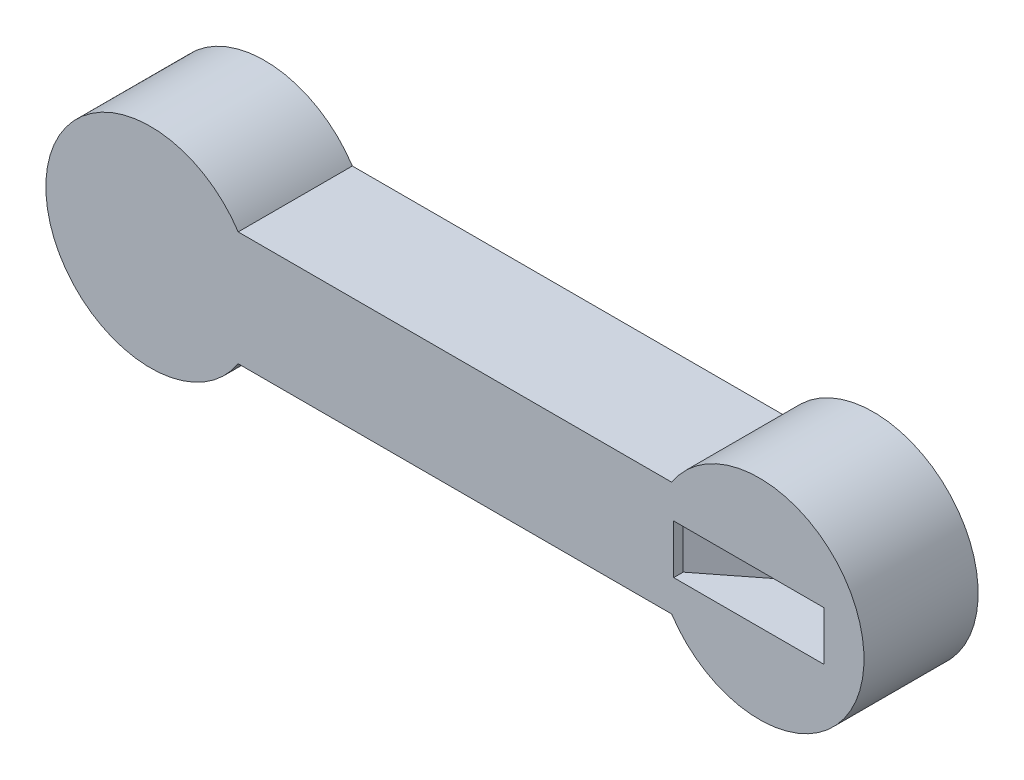
ISO-10303-21;
HEADER;
FILE_DESCRIPTION(('STEP AP214'),'2;1');
FILE_NAME('part.step','',(''),(''),'','','');
FILE_SCHEMA(('AUTOMOTIVE_DESIGN { 1 0 10303 214 1 1 1 1 }'));
ENDSEC;
DATA;
#1=APPLICATION_CONTEXT('core data for automotive mechanical design processes');
#2=APPLICATION_PROTOCOL_DEFINITION('international standard','automotive_design',2000,#1);
#3=PRODUCT_CONTEXT('',#1,'mechanical');
#4=PRODUCT('Part','Part','',(#3));
#5=PRODUCT_RELATED_PRODUCT_CATEGORY('part','',(#4));
#6=PRODUCT_DEFINITION_FORMATION('','',#4);
#7=PRODUCT_DEFINITION_CONTEXT('part definition',#1,'design');
#8=PRODUCT_DEFINITION('design','',#6,#7);
#9=PRODUCT_DEFINITION_SHAPE('','',#8);
#10=(LENGTH_UNIT() NAMED_UNIT(*) SI_UNIT(.MILLI.,.METRE.));
#11=(NAMED_UNIT(*) PLANE_ANGLE_UNIT() SI_UNIT($,.RADIAN.));
#12=(NAMED_UNIT(*) SI_UNIT($,.STERADIAN.) SOLID_ANGLE_UNIT());
#13=UNCERTAINTY_MEASURE_WITH_UNIT(LENGTH_MEASURE(1.E-05),#10,'distance_accuracy_value','');
#14=(GEOMETRIC_REPRESENTATION_CONTEXT(3) GLOBAL_UNCERTAINTY_ASSIGNED_CONTEXT((#13)) GLOBAL_UNIT_ASSIGNED_CONTEXT((#10,
#11,#12)) REPRESENTATION_CONTEXT('',''));
#15=CARTESIAN_POINT('',(0.,0.,0.));
#16=DIRECTION('',(0.,0.,1.));
#17=DIRECTION('',(1.,0.,0.));
#18=AXIS2_PLACEMENT_3D('',#15,#16,#17);
#19=CARTESIAN_POINT('',(0.,0.,30.));
#20=DIRECTION('',(0.,0.,1.));
#21=DIRECTION('',(1.,0.,0.));
#22=AXIS2_PLACEMENT_3D('',#19,#20,#21);
#23=PLANE('',#22);
#24=CARTESIAN_POINT('',(0.,0.,30.));
#25=DIRECTION('',(0.,0.,1.));
#26=DIRECTION('',(1.,0.,0.));
#27=AXIS2_PLACEMENT_3D('',#24,#25,#26);
#28=CIRCLE('',#27,27.5);
#29=CARTESIAN_POINT('',(23.0488611432322,15.,30.));
#30=VERTEX_POINT('',#29);
#31=CARTESIAN_POINT('',(23.0488611432322,-15.,30.));
#32=VERTEX_POINT('',#31);
#33=EDGE_CURVE('E216',#30,#32,#28,.T.);
#34=ORIENTED_EDGE('',*,*,#33,.T.);
#35=DIRECTION('',(1.,0.,0.));
#36=VECTOR('',#35,1.);
#37=CARTESIAN_POINT('',(0.,-15.,30.));
#38=LINE('',#37,#36);
#39=CARTESIAN_POINT('',(136.951138856768,-15.,30.));
#40=VERTEX_POINT('',#39);
#41=EDGE_CURVE('E219',#32,#40,#38,.T.);
#42=ORIENTED_EDGE('',*,*,#41,.T.);
#43=CARTESIAN_POINT('',(160.,0.,30.));
#44=DIRECTION('',(0.,0.,1.));
#45=DIRECTION('',(1.,0.,0.));
#46=AXIS2_PLACEMENT_3D('',#43,#44,#45);
#47=CIRCLE('',#46,27.5);
#48=CARTESIAN_POINT('',(136.951138856768,15.,30.));
#49=VERTEX_POINT('',#48);
#50=EDGE_CURVE('E222',#40,#49,#47,.T.);
#51=ORIENTED_EDGE('',*,*,#50,.T.);
#52=DIRECTION('',(1.,0.,0.));
#53=VECTOR('',#52,1.);
#54=CARTESIAN_POINT('',(0.,15.,30.));
#55=LINE('',#54,#53);
#56=EDGE_CURVE('E224',#30,#49,#55,.T.);
#57=ORIENTED_EDGE('',*,*,#56,.F.);
#58=EDGE_LOOP('',(#34,#42,#51,#57));
#59=FACE_BOUND('',#58,.T.);
#60=DIRECTION('',(0.,-1.,0.));
#61=VECTOR('',#60,1.);
#62=CARTESIAN_POINT('',(137.49791436977,6.45,30.));
#63=LINE('',#62,#61);
#64=CARTESIAN_POINT('',(137.49791436977,6.45,30.));
#65=VERTEX_POINT('',#64);
#66=CARTESIAN_POINT('',(137.49791436977,-6.45,30.));
#67=VERTEX_POINT('',#66);
#68=EDGE_CURVE('E160',#65,#67,#63,.T.);
#69=ORIENTED_EDGE('',*,*,#68,.F.);
#70=DIRECTION('',(-1.,0.,0.));
#71=VECTOR('',#70,1.);
#72=CARTESIAN_POINT('',(0.,6.45000000000005,30.));
#73=LINE('',#72,#71);
#74=CARTESIAN_POINT('',(176.95,6.45000000000005,30.));
#75=VERTEX_POINT('',#74);
#76=EDGE_CURVE('E145',#75,#65,#73,.T.);
#77=ORIENTED_EDGE('',*,*,#76,.F.);
#78=DIRECTION('',(0.,-1.,0.));
#79=VECTOR('',#78,1.);
#80=CARTESIAN_POINT('',(176.95,0.,30.));
#81=LINE('',#80,#79);
#82=CARTESIAN_POINT('',(176.95,-6.44999999999995,30.));
#83=VERTEX_POINT('',#82);
#84=EDGE_CURVE('E57',#75,#83,#81,.T.);
#85=ORIENTED_EDGE('',*,*,#84,.T.);
#86=DIRECTION('',(1.,0.,0.));
#87=VECTOR('',#86,1.);
#88=CARTESIAN_POINT('',(0.,-6.44999999999995,30.));
#89=LINE('',#88,#87);
#90=EDGE_CURVE('E166',#67,#83,#89,.T.);
#91=ORIENTED_EDGE('',*,*,#90,.F.);
#92=EDGE_LOOP('',(#69,#77,#85,#91));
#93=FACE_BOUND('',#92,.T.);
#94=ADVANCED_FACE('F41',(#59,#93),#23,.T.);
#95=CARTESIAN_POINT('',(0.,0.,4.5));
#96=DIRECTION('',(0.,0.,-1.));
#97=DIRECTION('',(-1.,0.,0.));
#98=AXIS2_PLACEMENT_3D('',#95,#96,#97);
#99=PLANE('',#98);
#100=DIRECTION('',(1.,0.,0.));
#101=VECTOR('',#100,1.);
#102=CARTESIAN_POINT('',(148.519342789878,6.45000000000005,4.5));
#103=LINE('',#102,#101);
#104=CARTESIAN_POINT('',(148.519342789878,6.45000000000005,4.5));
#105=VERTEX_POINT('',#104);
#106=CARTESIAN_POINT('',(153.497914369771,6.45000000000005,4.5));
#107=VERTEX_POINT('',#106);
#108=EDGE_CURVE('E187',#105,#107,#103,.T.);
#109=ORIENTED_EDGE('',*,*,#108,.T.);
#110=DIRECTION('',(0.,-1.,0.));
#111=VECTOR('',#110,1.);
#112=CARTESIAN_POINT('',(153.497914369771,0.,4.5));
#113=LINE('',#112,#111);
#114=CARTESIAN_POINT('',(153.497914369771,-6.44999999999995,4.5));
#115=VERTEX_POINT('',#114);
#116=EDGE_CURVE('E11',#107,#115,#113,.T.);
#117=ORIENTED_EDGE('',*,*,#116,.T.);
#118=DIRECTION('',(-1.,0.,0.));
#119=VECTOR('',#118,1.);
#120=CARTESIAN_POINT('',(148.519342789878,-6.44999999999995,4.5));
#121=LINE('',#120,#119);
#122=CARTESIAN_POINT('',(148.519342789878,-6.44999999999995,4.5));
#123=VERTEX_POINT('',#122);
#124=EDGE_CURVE('E193',#115,#123,#121,.T.);
#125=ORIENTED_EDGE('',*,*,#124,.T.);
#126=DIRECTION('',(0.,1.,0.));
#127=VECTOR('',#126,1.);
#128=CARTESIAN_POINT('',(148.519342789878,-6.44999999999995,4.5));
#129=LINE('',#128,#127);
#130=EDGE_CURVE('E182',#123,#105,#129,.T.);
#131=ORIENTED_EDGE('',*,*,#130,.T.);
#132=EDGE_LOOP('',(#109,#117,#125,#131));
#133=FACE_BOUND('',#132,.T.);
#134=ADVANCED_FACE('F270',(#133),#99,.T.);
#135=CARTESIAN_POINT('',(0.,0.,30.));
#136=DIRECTION('',(0.,0.,-1.));
#137=DIRECTION('',(-1.,0.,0.));
#138=AXIS2_PLACEMENT_3D('',#135,#136,#137);
#139=CYLINDRICAL_SURFACE('',#138,27.5);
#140=CARTESIAN_POINT('',(0.,0.,0.));
#141=DIRECTION('',(0.,0.,1.));
#142=DIRECTION('',(1.,0.,0.));
#143=AXIS2_PLACEMENT_3D('',#140,#141,#142);
#144=CIRCLE('',#143,27.5);
#145=CARTESIAN_POINT('',(23.0488611432322,15.,0.));
#146=VERTEX_POINT('',#145);
#147=CARTESIAN_POINT('',(23.0488611432322,-15.,0.));
#148=VERTEX_POINT('',#147);
#149=EDGE_CURVE('E208',#146,#148,#144,.T.);
#150=ORIENTED_EDGE('',*,*,#149,.T.);
#151=DIRECTION('',(0.,0.,-1.));
#152=VECTOR('',#151,1.);
#153=CARTESIAN_POINT('',(23.0488611432322,-15.,30.));
#154=LINE('',#153,#152);
#155=EDGE_CURVE('E243',#32,#148,#154,.T.);
#156=ORIENTED_EDGE('',*,*,#155,.F.);
#157=ORIENTED_EDGE('',*,*,#33,.F.);
#158=DIRECTION('',(0.,0.,-1.));
#159=VECTOR('',#158,1.);
#160=CARTESIAN_POINT('',(23.0488611432322,15.,30.));
#161=LINE('',#160,#159);
#162=EDGE_CURVE('E227',#30,#146,#161,.T.);
#163=ORIENTED_EDGE('',*,*,#162,.T.);
#164=EDGE_LOOP('',(#150,#156,#157,#163));
#165=FACE_BOUND('',#164,.T.);
#166=ADVANCED_FACE('F43',(#165),#139,.T.);
#167=CARTESIAN_POINT('',(0.,-15.,30.));
#168=DIRECTION('',(0.,1.,0.));
#169=DIRECTION('',(-1.,0.,0.));
#170=AXIS2_PLACEMENT_3D('',#167,#168,#169);
#171=PLANE('',#170);
#172=DIRECTION('',(1.,0.,0.));
#173=VECTOR('',#172,1.);
#174=CARTESIAN_POINT('',(0.,-15.,0.));
#175=LINE('',#174,#173);
#176=CARTESIAN_POINT('',(136.951138856768,-15.,0.));
#177=VERTEX_POINT('',#176);
#178=EDGE_CURVE('E230',#148,#177,#175,.T.);
#179=ORIENTED_EDGE('',*,*,#178,.T.);
#180=DIRECTION('',(0.,0.,-1.));
#181=VECTOR('',#180,1.);
#182=CARTESIAN_POINT('',(136.951138856768,-15.,30.));
#183=LINE('',#182,#181);
#184=EDGE_CURVE('E240',#40,#177,#183,.T.);
#185=ORIENTED_EDGE('',*,*,#184,.F.);
#186=ORIENTED_EDGE('',*,*,#41,.F.);
#187=ORIENTED_EDGE('',*,*,#155,.T.);
#188=EDGE_LOOP('',(#179,#185,#186,#187));
#189=FACE_BOUND('',#188,.T.);
#190=ADVANCED_FACE('F322',(#189),#171,.F.);
#191=CARTESIAN_POINT('',(160.,0.,30.));
#192=DIRECTION('',(0.,0.,-1.));
#193=DIRECTION('',(-1.,0.,0.));
#194=AXIS2_PLACEMENT_3D('',#191,#192,#193);
#195=CYLINDRICAL_SURFACE('',#194,27.5);
#196=CARTESIAN_POINT('',(160.,0.,0.));
#197=DIRECTION('',(0.,0.,1.));
#198=DIRECTION('',(1.,0.,0.));
#199=AXIS2_PLACEMENT_3D('',#196,#197,#198);
#200=CIRCLE('',#199,27.5);
#201=CARTESIAN_POINT('',(136.951138856768,15.,0.));
#202=VERTEX_POINT('',#201);
#203=EDGE_CURVE('E232',#177,#202,#200,.T.);
#204=ORIENTED_EDGE('',*,*,#203,.T.);
#205=DIRECTION('',(0.,0.,-1.));
#206=VECTOR('',#205,1.);
#207=CARTESIAN_POINT('',(136.951138856768,15.,30.));
#208=LINE('',#207,#206);
#209=EDGE_CURVE('E238',#49,#202,#208,.T.);
#210=ORIENTED_EDGE('',*,*,#209,.F.);
#211=ORIENTED_EDGE('',*,*,#50,.F.);
#212=ORIENTED_EDGE('',*,*,#184,.T.);
#213=EDGE_LOOP('',(#204,#210,#211,#212));
#214=FACE_BOUND('',#213,.T.);
#215=ADVANCED_FACE('F319',(#214),#195,.T.);
#216=CARTESIAN_POINT('',(0.,15.,30.));
#217=DIRECTION('',(0.,1.,0.));
#218=DIRECTION('',(0.,0.,1.));
#219=AXIS2_PLACEMENT_3D('',#216,#217,#218);
#220=PLANE('',#219);
#221=DIRECTION('',(1.,0.,0.));
#222=VECTOR('',#221,1.);
#223=CARTESIAN_POINT('',(0.,15.,0.));
#224=LINE('',#223,#222);
#225=EDGE_CURVE('E220',#146,#202,#224,.T.);
#226=ORIENTED_EDGE('',*,*,#225,.F.);
#227=ORIENTED_EDGE('',*,*,#162,.F.);
#228=ORIENTED_EDGE('',*,*,#56,.T.);
#229=ORIENTED_EDGE('',*,*,#209,.T.);
#230=EDGE_LOOP('',(#226,#227,#228,#229));
#231=FACE_BOUND('',#230,.T.);
#232=ADVANCED_FACE('F316',(#231),#220,.T.);
#233=CARTESIAN_POINT('',(0.,0.,0.));
#234=DIRECTION('',(0.,0.,1.));
#235=DIRECTION('',(1.,0.,0.));
#236=AXIS2_PLACEMENT_3D('',#233,#234,#235);
#237=PLANE('',#236);
#238=CARTESIAN_POINT('',(0.,0.,0.));
#239=DIRECTION('',(0.,0.,1.));
#240=DIRECTION('',(1.,0.,0.));
#241=AXIS2_PLACEMENT_3D('',#238,#239,#240);
#242=CIRCLE('',#241,20.0000000000004);
#243=CARTESIAN_POINT('',(20.0000000000004,0.,0.));
#244=VERTEX_POINT('',#243);
#245=EDGE_CURVE('E45',#244,#244,#242,.T.);
#246=ORIENTED_EDGE('',*,*,#245,.T.);
#247=EDGE_LOOP('',(#246));
#248=FACE_BOUND('',#247,.T.);
#249=DIRECTION('',(1.,0.,0.));
#250=VECTOR('',#249,1.);
#251=CARTESIAN_POINT('',(148.519342789878,6.45000000000005,0.));
#252=LINE('',#251,#250);
#253=CARTESIAN_POINT('',(148.519342789878,6.45000000000005,0.));
#254=VERTEX_POINT('',#253);
#255=CARTESIAN_POINT('',(181.919342789878,6.45000000000005,0.));
#256=VERTEX_POINT('',#255);
#257=EDGE_CURVE('E199',#254,#256,#252,.T.);
#258=ORIENTED_EDGE('',*,*,#257,.F.);
#259=DIRECTION('',(0.,1.,0.));
#260=VECTOR('',#259,1.);
#261=CARTESIAN_POINT('',(148.519342789878,-6.44999999999995,0.));
#262=LINE('',#261,#260);
#263=CARTESIAN_POINT('',(148.519342789878,-6.44999999999995,0.));
#264=VERTEX_POINT('',#263);
#265=EDGE_CURVE('E176',#264,#254,#262,.T.);
#266=ORIENTED_EDGE('',*,*,#265,.F.);
#267=DIRECTION('',(-1.,0.,0.));
#268=VECTOR('',#267,1.);
#269=CARTESIAN_POINT('',(148.519342789878,-6.44999999999995,0.));
#270=LINE('',#269,#268);
#271=CARTESIAN_POINT('',(181.919342789878,-6.44999999999995,0.));
#272=VERTEX_POINT('',#271);
#273=EDGE_CURVE('E186',#272,#264,#270,.T.);
#274=ORIENTED_EDGE('',*,*,#273,.F.);
#275=DIRECTION('',(0.,-1.,0.));
#276=VECTOR('',#275,1.);
#277=CARTESIAN_POINT('',(181.919342789878,-6.44999999999995,0.));
#278=LINE('',#277,#276);
#279=EDGE_CURVE('E201',#256,#272,#278,.T.);
#280=ORIENTED_EDGE('',*,*,#279,.F.);
#281=EDGE_LOOP('',(#258,#266,#274,#280));
#282=FACE_BOUND('',#281,.T.);
#283=ORIENTED_EDGE('',*,*,#149,.F.);
#284=ORIENTED_EDGE('',*,*,#225,.T.);
#285=ORIENTED_EDGE('',*,*,#203,.F.);
#286=ORIENTED_EDGE('',*,*,#178,.F.);
#287=EDGE_LOOP('',(#283,#284,#285,#286));
#288=FACE_BOUND('',#287,.T.);
#289=ADVANCED_FACE('F267',(#248,#282,#288),#237,.F.);
#290=CARTESIAN_POINT('',(148.519342789878,-6.44999999999995,4.5));
#291=DIRECTION('',(-1.,0.,0.));
#292=DIRECTION('',(0.,0.,1.));
#293=AXIS2_PLACEMENT_3D('',#290,#291,#292);
#294=PLANE('',#293);
#295=ORIENTED_EDGE('',*,*,#265,.T.);
#296=DIRECTION('',(0.,0.,-1.));
#297=VECTOR('',#296,1.);
#298=CARTESIAN_POINT('',(148.519342789878,6.45000000000005,4.5));
#299=LINE('',#298,#297);
#300=EDGE_CURVE('E197',#105,#254,#299,.T.);
#301=ORIENTED_EDGE('',*,*,#300,.F.);
#302=ORIENTED_EDGE('',*,*,#130,.F.);
#303=DIRECTION('',(0.,0.,-1.));
#304=VECTOR('',#303,1.);
#305=CARTESIAN_POINT('',(148.519342789878,-6.44999999999995,4.5));
#306=LINE('',#305,#304);
#307=EDGE_CURVE('E205',#123,#264,#306,.T.);
#308=ORIENTED_EDGE('',*,*,#307,.T.);
#309=EDGE_LOOP('',(#295,#301,#302,#308));
#310=FACE_BOUND('',#309,.T.);
#311=ADVANCED_FACE('F265',(#310),#294,.F.);
#312=CARTESIAN_POINT('',(148.519342789878,-6.44999999999995,4.5));
#313=DIRECTION('',(0.,-1.,0.));
#314=DIRECTION('',(0.,0.,-1.));
#315=AXIS2_PLACEMENT_3D('',#312,#313,#314);
#316=PLANE('',#315);
#317=ORIENTED_EDGE('',*,*,#273,.T.);
#318=ORIENTED_EDGE('',*,*,#307,.F.);
#319=ORIENTED_EDGE('',*,*,#124,.F.);
#320=DIRECTION('',(0.,0.,-1.));
#321=VECTOR('',#320,1.);
#322=CARTESIAN_POINT('',(153.497914369771,-6.44999999999995,30.));
#323=LINE('',#322,#321);
#324=CARTESIAN_POINT('',(153.49791436977,-6.45,15.));
#325=VERTEX_POINT('',#324);
#326=EDGE_CURVE('E174',#325,#115,#323,.T.);
#327=ORIENTED_EDGE('',*,*,#326,.F.);
#328=DIRECTION('',(0.788024373724564,0.,-0.615644041972314));
#329=VECTOR('',#328,1.);
#330=CARTESIAN_POINT('',(65.4555466835088,-6.45,83.7830997548915));
#331=LINE('',#330,#329);
#332=CARTESIAN_POINT('',(137.49791436977,-6.45,27.5));
#333=VERTEX_POINT('',#332);
#334=EDGE_CURVE('E164',#333,#325,#331,.T.);
#335=ORIENTED_EDGE('',*,*,#334,.F.);
#336=DIRECTION('',(0.,0.,-1.));
#337=VECTOR('',#336,1.);
#338=CARTESIAN_POINT('',(137.49791436977,-6.45,-1.52653350371257E-12));
#339=LINE('',#338,#337);
#340=EDGE_CURVE('E279',#67,#333,#339,.T.);
#341=ORIENTED_EDGE('',*,*,#340,.F.);
#342=ORIENTED_EDGE('',*,*,#90,.T.);
#343=DIRECTION('',(0.,0.,-1.));
#344=VECTOR('',#343,1.);
#345=CARTESIAN_POINT('',(176.95,-6.44999999999995,30.));
#346=LINE('',#345,#344);
#347=CARTESIAN_POINT('',(176.95,-6.44999999999995,4.5));
#348=VERTEX_POINT('',#347);
#349=EDGE_CURVE('E177',#83,#348,#346,.T.);
#350=ORIENTED_EDGE('',*,*,#349,.T.);
#351=CARTESIAN_POINT('',(181.919342789878,-6.44999999999995,4.5));
#352=VERTEX_POINT('',#351);
#353=EDGE_CURVE('E194',#352,#348,#121,.T.);
#354=ORIENTED_EDGE('',*,*,#353,.F.);
#355=DIRECTION('',(0.,0.,-1.));
#356=VECTOR('',#355,1.);
#357=CARTESIAN_POINT('',(181.919342789878,-6.44999999999995,4.5));
#358=LINE('',#357,#356);
#359=EDGE_CURVE('E209',#352,#272,#358,.T.);
#360=ORIENTED_EDGE('',*,*,#359,.T.);
#361=EDGE_LOOP('',(#317,#318,#319,#327,#335,#341,#342,#350,#354,#360));
#362=FACE_BOUND('',#361,.T.);
#363=ADVANCED_FACE('F251',(#362),#316,.F.);
#364=CARTESIAN_POINT('',(181.919342789878,-6.44999999999995,4.5));
#365=DIRECTION('',(1.,0.,0.));
#366=DIRECTION('',(0.,0.,-1.));
#367=AXIS2_PLACEMENT_3D('',#364,#365,#366);
#368=PLANE('',#367);
#369=ORIENTED_EDGE('',*,*,#279,.T.);
#370=ORIENTED_EDGE('',*,*,#359,.F.);
#371=DIRECTION('',(0.,-1.,0.));
#372=VECTOR('',#371,1.);
#373=CARTESIAN_POINT('',(181.919342789878,-6.44999999999995,4.5));
#374=LINE('',#373,#372);
#375=CARTESIAN_POINT('',(181.919342789878,6.45000000000005,4.5));
#376=VERTEX_POINT('',#375);
#377=EDGE_CURVE('E190',#376,#352,#374,.T.);
#378=ORIENTED_EDGE('',*,*,#377,.F.);
#379=DIRECTION('',(0.,0.,-1.));
#380=VECTOR('',#379,1.);
#381=CARTESIAN_POINT('',(181.919342789878,6.45000000000005,4.5));
#382=LINE('',#381,#380);
#383=EDGE_CURVE('E211',#376,#256,#382,.T.);
#384=ORIENTED_EDGE('',*,*,#383,.T.);
#385=EDGE_LOOP('',(#369,#370,#378,#384));
#386=FACE_BOUND('',#385,.T.);
#387=ADVANCED_FACE('F256',(#386),#368,.F.);
#388=CARTESIAN_POINT('',(148.519342789878,6.45000000000005,4.5));
#389=DIRECTION('',(0.,1.,0.));
#390=DIRECTION('',(0.,0.,1.));
#391=AXIS2_PLACEMENT_3D('',#388,#389,#390);
#392=PLANE('',#391);
#393=CARTESIAN_POINT('',(176.95,6.45000000000005,4.5));
#394=VERTEX_POINT('',#393);
#395=EDGE_CURVE('E185',#394,#376,#103,.T.);
#396=ORIENTED_EDGE('',*,*,#395,.F.);
#397=DIRECTION('',(0.,0.,-1.));
#398=VECTOR('',#397,1.);
#399=CARTESIAN_POINT('',(176.95,6.45000000000005,30.));
#400=LINE('',#399,#398);
#401=EDGE_CURVE('E151',#75,#394,#400,.T.);
#402=ORIENTED_EDGE('',*,*,#401,.F.);
#403=ORIENTED_EDGE('',*,*,#76,.T.);
#404=DIRECTION('',(0.,0.,-1.));
#405=VECTOR('',#404,1.);
#406=CARTESIAN_POINT('',(137.49791436977,6.45,-1.52653350371257E-12));
#407=LINE('',#406,#405);
#408=CARTESIAN_POINT('',(137.49791436977,6.45,27.5));
#409=VERTEX_POINT('',#408);
#410=EDGE_CURVE('E149',#65,#409,#407,.T.);
#411=ORIENTED_EDGE('',*,*,#410,.T.);
#412=DIRECTION('',(0.788024373724564,0.,-0.615644041972314));
#413=VECTOR('',#412,1.);
#414=CARTESIAN_POINT('',(65.4555466835088,6.45,83.7830997548915));
#415=LINE('',#414,#413);
#416=CARTESIAN_POINT('',(153.49791436977,6.45,15.));
#417=VERTEX_POINT('',#416);
#418=EDGE_CURVE('E163',#409,#417,#415,.T.);
#419=ORIENTED_EDGE('',*,*,#418,.T.);
#420=DIRECTION('',(0.,0.,-1.));
#421=VECTOR('',#420,1.);
#422=CARTESIAN_POINT('',(153.497914369771,6.45000000000005,30.));
#423=LINE('',#422,#421);
#424=EDGE_CURVE('E65',#417,#107,#423,.T.);
#425=ORIENTED_EDGE('',*,*,#424,.T.);
#426=ORIENTED_EDGE('',*,*,#108,.F.);
#427=ORIENTED_EDGE('',*,*,#300,.T.);
#428=ORIENTED_EDGE('',*,*,#257,.T.);
#429=ORIENTED_EDGE('',*,*,#383,.F.);
#430=EDGE_LOOP('',(#396,#402,#403,#411,#419,#425,#426,#427,#428,#429));
#431=FACE_BOUND('',#430,.T.);
#432=ADVANCED_FACE('F148',(#431),#392,.F.);
#433=DIRECTION('',(0.,-1.,0.));
#434=VECTOR('',#433,1.);
#435=CARTESIAN_POINT('',(176.95,0.,4.5));
#436=LINE('',#435,#434);
#437=EDGE_CURVE('E50',#394,#348,#436,.T.);
#438=ORIENTED_EDGE('',*,*,#437,.F.);
#439=ORIENTED_EDGE('',*,*,#395,.T.);
#440=ORIENTED_EDGE('',*,*,#377,.T.);
#441=ORIENTED_EDGE('',*,*,#353,.T.);
#442=EDGE_LOOP('',(#438,#439,#440,#441));
#443=FACE_BOUND('',#442,.T.);
#444=ADVANCED_FACE('F252',(#443),#99,.T.);
#445=CARTESIAN_POINT('',(153.497914369771,0.,30.));
#446=DIRECTION('',(1.,0.,0.));
#447=DIRECTION('',(0.,0.,-1.));
#448=AXIS2_PLACEMENT_3D('',#445,#446,#447);
#449=PLANE('',#448);
#450=DIRECTION('',(0.,-1.,0.));
#451=VECTOR('',#450,1.);
#452=CARTESIAN_POINT('',(153.49791436977,6.45,15.));
#453=LINE('',#452,#451);
#454=EDGE_CURVE('E154',#417,#325,#453,.T.);
#455=ORIENTED_EDGE('',*,*,#454,.T.);
#456=ORIENTED_EDGE('',*,*,#326,.T.);
#457=ORIENTED_EDGE('',*,*,#116,.F.);
#458=ORIENTED_EDGE('',*,*,#424,.F.);
#459=EDGE_LOOP('',(#455,#456,#457,#458));
#460=FACE_BOUND('',#459,.T.);
#461=ADVANCED_FACE('F275',(#460),#449,.T.);
#462=CARTESIAN_POINT('',(176.95,0.,30.));
#463=DIRECTION('',(1.,0.,0.));
#464=DIRECTION('',(0.,0.,-1.));
#465=AXIS2_PLACEMENT_3D('',#462,#463,#464);
#466=PLANE('',#465);
#467=ORIENTED_EDGE('',*,*,#437,.T.);
#468=ORIENTED_EDGE('',*,*,#349,.F.);
#469=ORIENTED_EDGE('',*,*,#84,.F.);
#470=ORIENTED_EDGE('',*,*,#401,.T.);
#471=EDGE_LOOP('',(#467,#468,#469,#470));
#472=FACE_BOUND('',#471,.T.);
#473=ADVANCED_FACE('F247',(#472),#466,.F.);
#474=CARTESIAN_POINT('',(65.4555466835088,6.45,83.7830997548915));
#475=DIRECTION('',(-0.615644041972314,0.,-0.788024373724564));
#476=DIRECTION('',(-0.788024373724564,0.,0.615644041972314));
#477=AXIS2_PLACEMENT_3D('',#474,#475,#476);
#478=PLANE('',#477);
#479=ORIENTED_EDGE('',*,*,#334,.T.);
#480=ORIENTED_EDGE('',*,*,#454,.F.);
#481=ORIENTED_EDGE('',*,*,#418,.F.);
#482=DIRECTION('',(0.,-1.,0.));
#483=VECTOR('',#482,1.);
#484=CARTESIAN_POINT('',(137.49791436977,6.45,27.5));
#485=LINE('',#484,#483);
#486=EDGE_CURVE('E162',#409,#333,#485,.T.);
#487=ORIENTED_EDGE('',*,*,#486,.T.);
#488=EDGE_LOOP('',(#479,#480,#481,#487));
#489=FACE_BOUND('',#488,.T.);
#490=ADVANCED_FACE('F300',(#489),#478,.F.);
#491=CARTESIAN_POINT('',(137.49791436977,6.45,-1.52653350371257E-12));
#492=DIRECTION('',(-1.,0.,0.));
#493=DIRECTION('',(0.,0.,1.));
#494=AXIS2_PLACEMENT_3D('',#491,#492,#493);
#495=PLANE('',#494);
#496=ORIENTED_EDGE('',*,*,#340,.T.);
#497=ORIENTED_EDGE('',*,*,#486,.F.);
#498=ORIENTED_EDGE('',*,*,#410,.F.);
#499=ORIENTED_EDGE('',*,*,#68,.T.);
#500=EDGE_LOOP('',(#496,#497,#498,#499));
#501=FACE_BOUND('',#500,.T.);
#502=ADVANCED_FACE('F159',(#501),#495,.F.);
#503=CARTESIAN_POINT('',(0.,0.,3.65));
#504=DIRECTION('',(0.,0.,-1.));
#505=DIRECTION('',(-1.,0.,0.));
#506=AXIS2_PLACEMENT_3D('',#503,#504,#505);
#507=CYLINDRICAL_SURFACE('',#506,20.0000000000004);
#508=CARTESIAN_POINT('',(0.,0.,3.65));
#509=DIRECTION('',(0.,0.,-1.));
#510=DIRECTION('',(-1.,0.,0.));
#511=AXIS2_PLACEMENT_3D('',#508,#509,#510);
#512=CIRCLE('',#511,20.0000000000004);
#513=CARTESIAN_POINT('',(-20.0000000000004,0.,3.65));
#514=VERTEX_POINT('',#513);
#515=EDGE_CURVE('E281',#514,#514,#512,.T.);
#516=ORIENTED_EDGE('',*,*,#515,.F.);
#517=EDGE_LOOP('',(#516));
#518=FACE_BOUND('',#517,.T.);
#519=ORIENTED_EDGE('',*,*,#245,.F.);
#520=EDGE_LOOP('',(#519));
#521=FACE_BOUND('',#520,.T.);
#522=ADVANCED_FACE('F289',(#518,#521),#507,.F.);
#523=CARTESIAN_POINT('',(0.,0.,3.65));
#524=DIRECTION('',(0.,0.,-1.));
#525=DIRECTION('',(-1.,0.,0.));
#526=AXIS2_PLACEMENT_3D('',#523,#524,#525);
#527=PLANE('',#526);
#528=ORIENTED_EDGE('',*,*,#515,.T.);
#529=EDGE_LOOP('',(#528));
#530=FACE_BOUND('',#529,.T.);
#531=ADVANCED_FACE('F291',(#530),#527,.T.);
#532=CLOSED_SHELL('',(#94,#134,#166,#190,#215,#232,#289,#311,#363,#387,#432,#444,#461,#473,#490,
#502,#522,#531));
#533=MANIFOLD_SOLID_BREP('B2',#532);
#534=ADVANCED_BREP_SHAPE_REPRESENTATION('',(#18,#533),#14);
#535=SHAPE_DEFINITION_REPRESENTATION(#9,#534);
ENDSEC;
END-ISO-10303-21;
